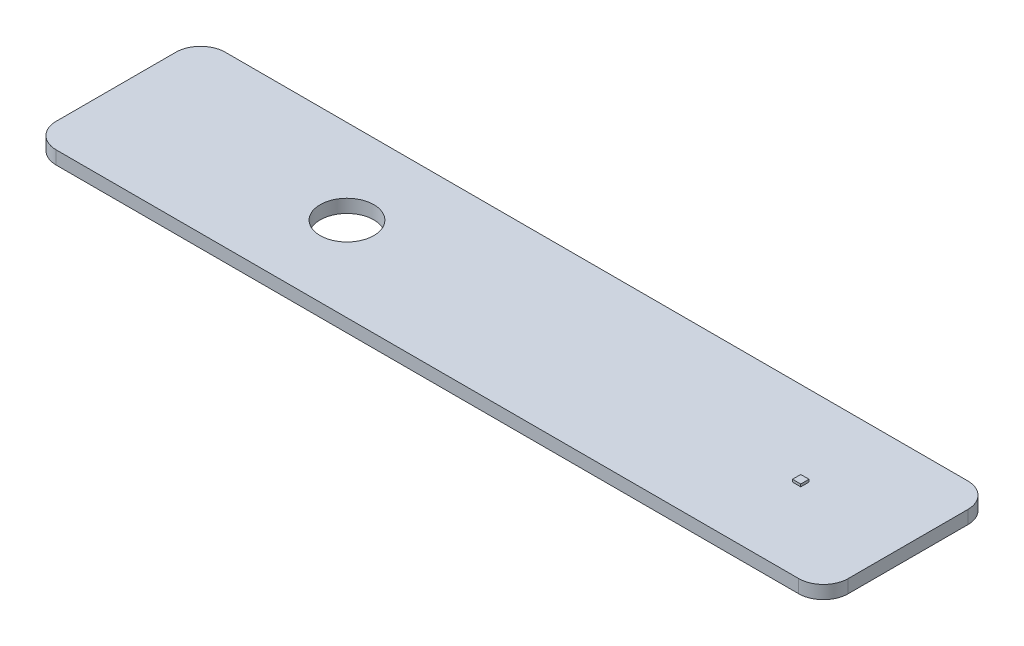
ISO-10303-21;
HEADER;
FILE_DESCRIPTION(('STEP AP214'),'2;1');
FILE_NAME('part.step','',(''),(''),'','','');
FILE_SCHEMA(('AUTOMOTIVE_DESIGN { 1 0 10303 214 1 1 1 1 }'));
ENDSEC;
DATA;
#1=APPLICATION_CONTEXT('core data for automotive mechanical design processes');
#2=APPLICATION_PROTOCOL_DEFINITION('international standard','automotive_design',2000,#1);
#3=PRODUCT_CONTEXT('',#1,'mechanical');
#4=PRODUCT('Part','Part','',(#3));
#5=PRODUCT_RELATED_PRODUCT_CATEGORY('part','',(#4));
#6=PRODUCT_DEFINITION_FORMATION('','',#4);
#7=PRODUCT_DEFINITION_CONTEXT('part definition',#1,'design');
#8=PRODUCT_DEFINITION('design','',#6,#7);
#9=PRODUCT_DEFINITION_SHAPE('','',#8);
#10=(LENGTH_UNIT() NAMED_UNIT(*) SI_UNIT(.MILLI.,.METRE.));
#11=(NAMED_UNIT(*) PLANE_ANGLE_UNIT() SI_UNIT($,.RADIAN.));
#12=(NAMED_UNIT(*) SI_UNIT($,.STERADIAN.) SOLID_ANGLE_UNIT());
#13=UNCERTAINTY_MEASURE_WITH_UNIT(LENGTH_MEASURE(1.E-05),#10,'distance_accuracy_value','');
#14=(GEOMETRIC_REPRESENTATION_CONTEXT(3) GLOBAL_UNCERTAINTY_ASSIGNED_CONTEXT((#13)) GLOBAL_UNIT_ASSIGNED_CONTEXT((#10,
#11,#12)) REPRESENTATION_CONTEXT('',''));
#15=CARTESIAN_POINT('',(0.,0.,0.));
#16=DIRECTION('',(0.,0.,1.));
#17=DIRECTION('',(1.,0.,0.));
#18=AXIS2_PLACEMENT_3D('',#15,#16,#17);
#19=CARTESIAN_POINT('',(-45.,1.6,7.25));
#20=DIRECTION('',(0.,1.,0.));
#21=DIRECTION('',(0.,0.,1.));
#22=AXIS2_PLACEMENT_3D('',#19,#20,#21);
#23=PLANE('',#22);
#24=CARTESIAN_POINT('',(-20.,1.6,0.));
#25=DIRECTION('',(0.,1.,0.));
#26=DIRECTION('',(0.,0.,1.));
#27=AXIS2_PLACEMENT_3D('',#24,#25,#26);
#28=CIRCLE('',#27,3.25);
#29=CARTESIAN_POINT('',(-20.,1.6,3.25));
#30=VERTEX_POINT('',#29);
#31=EDGE_CURVE('E416',#30,#30,#28,.T.);
#32=ORIENTED_EDGE('',*,*,#31,.F.);
#33=EDGE_LOOP('',(#32));
#34=FACE_BOUND('',#33,.T.);
#35=CARTESIAN_POINT('',(-45.,1.6,7.25));
#36=DIRECTION('',(0.,1.,0.));
#37=DIRECTION('',(0.,0.,1.));
#38=AXIS2_PLACEMENT_3D('',#35,#36,#37);
#39=CIRCLE('',#38,3.);
#40=CARTESIAN_POINT('',(-48.,1.6,7.25));
#41=VERTEX_POINT('',#40);
#42=CARTESIAN_POINT('',(-45.,1.6,10.25));
#43=VERTEX_POINT('',#42);
#44=EDGE_CURVE('E156',#41,#43,#39,.T.);
#45=ORIENTED_EDGE('',*,*,#44,.T.);
#46=DIRECTION('',(1.,0.,0.));
#47=VECTOR('',#46,1.);
#48=CARTESIAN_POINT('',(-45.,1.6,10.25));
#49=LINE('',#48,#47);
#50=CARTESIAN_POINT('',(45.,1.6,10.25));
#51=VERTEX_POINT('',#50);
#52=EDGE_CURVE('E159',#43,#51,#49,.T.);
#53=ORIENTED_EDGE('',*,*,#52,.T.);
#54=CARTESIAN_POINT('',(45.,1.6,7.25));
#55=DIRECTION('',(0.,1.,0.));
#56=DIRECTION('',(0.,0.,1.));
#57=AXIS2_PLACEMENT_3D('',#54,#55,#56);
#58=CIRCLE('',#57,3.);
#59=CARTESIAN_POINT('',(48.,1.6,7.25));
#60=VERTEX_POINT('',#59);
#61=EDGE_CURVE('E162',#51,#60,#58,.T.);
#62=ORIENTED_EDGE('',*,*,#61,.T.);
#63=DIRECTION('',(0.,0.,1.));
#64=VECTOR('',#63,1.);
#65=CARTESIAN_POINT('',(48.,1.6,-7.25));
#66=LINE('',#65,#64);
#67=CARTESIAN_POINT('',(48.,1.6,-7.25));
#68=VERTEX_POINT('',#67);
#69=EDGE_CURVE('E164',#68,#60,#66,.T.);
#70=ORIENTED_EDGE('',*,*,#69,.F.);
#71=CARTESIAN_POINT('',(45.,1.6,-7.25));
#72=DIRECTION('',(0.,-1.,0.));
#73=DIRECTION('',(0.,0.,-1.));
#74=AXIS2_PLACEMENT_3D('',#71,#72,#73);
#75=CIRCLE('',#74,3.);
#76=CARTESIAN_POINT('',(45.,1.6,-10.25));
#77=VERTEX_POINT('',#76);
#78=EDGE_CURVE('E167',#77,#68,#75,.T.);
#79=ORIENTED_EDGE('',*,*,#78,.F.);
#80=DIRECTION('',(1.,0.,0.));
#81=VECTOR('',#80,1.);
#82=CARTESIAN_POINT('',(-45.,1.6,-10.25));
#83=LINE('',#82,#81);
#84=CARTESIAN_POINT('',(-45.,1.6,-10.25));
#85=VERTEX_POINT('',#84);
#86=EDGE_CURVE('E170',#85,#77,#83,.T.);
#87=ORIENTED_EDGE('',*,*,#86,.F.);
#88=CARTESIAN_POINT('',(-45.,1.6,-7.25));
#89=DIRECTION('',(0.,1.,0.));
#90=DIRECTION('',(0.,0.,1.));
#91=AXIS2_PLACEMENT_3D('',#88,#89,#90);
#92=CIRCLE('',#91,3.);
#93=CARTESIAN_POINT('',(-48.,1.6,-7.25));
#94=VERTEX_POINT('',#93);
#95=EDGE_CURVE('E173',#85,#94,#92,.T.);
#96=ORIENTED_EDGE('',*,*,#95,.T.);
#97=DIRECTION('',(0.,0.,1.));
#98=VECTOR('',#97,1.);
#99=CARTESIAN_POINT('',(-48.,1.6,-7.25));
#100=LINE('',#99,#98);
#101=EDGE_CURVE('E175',#94,#41,#100,.T.);
#102=ORIENTED_EDGE('',*,*,#101,.T.);
#103=EDGE_LOOP('',(#45,#53,#62,#70,#79,#87,#96,#102));
#104=FACE_BOUND('',#103,.T.);
#105=DIRECTION('',(1.,0.,0.));
#106=VECTOR('',#105,1.);
#107=CARTESIAN_POINT('',(34.5,1.6,0.5));
#108=LINE('',#107,#106);
#109=CARTESIAN_POINT('',(34.5,1.6,0.5));
#110=VERTEX_POINT('',#109);
#111=CARTESIAN_POINT('',(35.5,1.6,0.5));
#112=VERTEX_POINT('',#111);
#113=EDGE_CURVE('E51',#110,#112,#108,.T.);
#114=ORIENTED_EDGE('',*,*,#113,.F.);
#115=DIRECTION('',(0.,0.,1.));
#116=VECTOR('',#115,1.);
#117=CARTESIAN_POINT('',(34.5,1.6,-0.5));
#118=LINE('',#117,#116);
#119=CARTESIAN_POINT('',(34.5,1.6,-0.5));
#120=VERTEX_POINT('',#119);
#121=EDGE_CURVE('E146',#120,#110,#118,.T.);
#122=ORIENTED_EDGE('',*,*,#121,.F.);
#123=DIRECTION('',(1.,0.,0.));
#124=VECTOR('',#123,1.);
#125=CARTESIAN_POINT('',(34.5,1.6,-0.5));
#126=LINE('',#125,#124);
#127=CARTESIAN_POINT('',(35.5,1.6,-0.5));
#128=VERTEX_POINT('',#127);
#129=EDGE_CURVE('E143',#120,#128,#126,.T.);
#130=ORIENTED_EDGE('',*,*,#129,.T.);
#131=DIRECTION('',(0.,0.,1.));
#132=VECTOR('',#131,1.);
#133=CARTESIAN_POINT('',(35.5,1.6,-0.5));
#134=LINE('',#133,#132);
#135=EDGE_CURVE('E56',#128,#112,#134,.T.);
#136=ORIENTED_EDGE('',*,*,#135,.T.);
#137=EDGE_LOOP('',(#114,#122,#130,#136));
#138=FACE_BOUND('',#137,.T.);
#139=ADVANCED_FACE('F36',(#34,#104,#138),#23,.T.);
#140=CARTESIAN_POINT('',(-45.,1.6,7.25));
#141=DIRECTION('',(0.,-1.,0.));
#142=DIRECTION('',(0.,0.,-1.));
#143=AXIS2_PLACEMENT_3D('',#140,#141,#142);
#144=CYLINDRICAL_SURFACE('',#143,3.);
#145=CARTESIAN_POINT('',(-45.,0.,7.25));
#146=DIRECTION('',(0.,1.,0.));
#147=DIRECTION('',(0.,0.,1.));
#148=AXIS2_PLACEMENT_3D('',#145,#146,#147);
#149=CIRCLE('',#148,3.);
#150=CARTESIAN_POINT('',(-48.,0.,7.25));
#151=VERTEX_POINT('',#150);
#152=CARTESIAN_POINT('',(-45.,0.,10.25));
#153=VERTEX_POINT('',#152);
#154=EDGE_CURVE('E147',#151,#153,#149,.T.);
#155=ORIENTED_EDGE('',*,*,#154,.T.);
#156=DIRECTION('',(0.,-1.,0.));
#157=VECTOR('',#156,1.);
#158=CARTESIAN_POINT('',(-45.,1.6,10.25));
#159=LINE('',#158,#157);
#160=EDGE_CURVE('E11',#43,#153,#159,.T.);
#161=ORIENTED_EDGE('',*,*,#160,.F.);
#162=ORIENTED_EDGE('',*,*,#44,.F.);
#163=DIRECTION('',(0.,-1.,0.));
#164=VECTOR('',#163,1.);
#165=CARTESIAN_POINT('',(-48.,1.6,7.25));
#166=LINE('',#165,#164);
#167=EDGE_CURVE('E176',#41,#151,#166,.T.);
#168=ORIENTED_EDGE('',*,*,#167,.T.);
#169=EDGE_LOOP('',(#155,#161,#162,#168));
#170=FACE_BOUND('',#169,.T.);
#171=ADVANCED_FACE('F38',(#170),#144,.T.);
#172=CARTESIAN_POINT('',(-45.,1.6,10.25));
#173=DIRECTION('',(0.,0.,-1.));
#174=DIRECTION('',(-1.,0.,0.));
#175=AXIS2_PLACEMENT_3D('',#172,#173,#174);
#176=PLANE('',#175);
#177=DIRECTION('',(1.,0.,0.));
#178=VECTOR('',#177,1.);
#179=CARTESIAN_POINT('',(-45.,0.,10.25));
#180=LINE('',#179,#178);
#181=CARTESIAN_POINT('',(45.,0.,10.25));
#182=VERTEX_POINT('',#181);
#183=EDGE_CURVE('E150',#153,#182,#180,.T.);
#184=ORIENTED_EDGE('',*,*,#183,.T.);
#185=DIRECTION('',(0.,-1.,0.));
#186=VECTOR('',#185,1.);
#187=CARTESIAN_POINT('',(45.,1.6,10.25));
#188=LINE('',#187,#186);
#189=EDGE_CURVE('E44',#51,#182,#188,.T.);
#190=ORIENTED_EDGE('',*,*,#189,.F.);
#191=ORIENTED_EDGE('',*,*,#52,.F.);
#192=ORIENTED_EDGE('',*,*,#160,.T.);
#193=EDGE_LOOP('',(#184,#190,#191,#192));
#194=FACE_BOUND('',#193,.T.);
#195=ADVANCED_FACE('F243',(#194),#176,.F.);
#196=CARTESIAN_POINT('',(45.,1.6,7.25));
#197=DIRECTION('',(0.,-1.,0.));
#198=DIRECTION('',(0.,0.,-1.));
#199=AXIS2_PLACEMENT_3D('',#196,#197,#198);
#200=CYLINDRICAL_SURFACE('',#199,3.);
#201=CARTESIAN_POINT('',(45.,0.,7.25));
#202=DIRECTION('',(0.,1.,0.));
#203=DIRECTION('',(0.,0.,1.));
#204=AXIS2_PLACEMENT_3D('',#201,#202,#203);
#205=CIRCLE('',#204,3.);
#206=CARTESIAN_POINT('',(48.,0.,7.25));
#207=VERTEX_POINT('',#206);
#208=EDGE_CURVE('E179',#182,#207,#205,.T.);
#209=ORIENTED_EDGE('',*,*,#208,.T.);
#210=DIRECTION('',(0.,-1.,0.));
#211=VECTOR('',#210,1.);
#212=CARTESIAN_POINT('',(48.,1.6,7.25));
#213=LINE('',#212,#211);
#214=EDGE_CURVE('E205',#60,#207,#213,.T.);
#215=ORIENTED_EDGE('',*,*,#214,.F.);
#216=ORIENTED_EDGE('',*,*,#61,.F.);
#217=ORIENTED_EDGE('',*,*,#189,.T.);
#218=EDGE_LOOP('',(#209,#215,#216,#217));
#219=FACE_BOUND('',#218,.T.);
#220=ADVANCED_FACE('F211',(#219),#200,.T.);
#221=CARTESIAN_POINT('',(48.,1.6,-7.25));
#222=DIRECTION('',(1.,0.,0.));
#223=DIRECTION('',(0.,0.,-1.));
#224=AXIS2_PLACEMENT_3D('',#221,#222,#223);
#225=PLANE('',#224);
#226=DIRECTION('',(0.,0.,1.));
#227=VECTOR('',#226,1.);
#228=CARTESIAN_POINT('',(48.,0.,-7.25));
#229=LINE('',#228,#227);
#230=CARTESIAN_POINT('',(48.,0.,-7.25));
#231=VERTEX_POINT('',#230);
#232=EDGE_CURVE('E182',#231,#207,#229,.T.);
#233=ORIENTED_EDGE('',*,*,#232,.F.);
#234=DIRECTION('',(0.,-1.,0.));
#235=VECTOR('',#234,1.);
#236=CARTESIAN_POINT('',(48.,1.6,-7.25));
#237=LINE('',#236,#235);
#238=EDGE_CURVE('E203',#68,#231,#237,.T.);
#239=ORIENTED_EDGE('',*,*,#238,.F.);
#240=ORIENTED_EDGE('',*,*,#69,.T.);
#241=ORIENTED_EDGE('',*,*,#214,.T.);
#242=EDGE_LOOP('',(#233,#239,#240,#241));
#243=FACE_BOUND('',#242,.T.);
#244=ADVANCED_FACE('F220',(#243),#225,.T.);
#245=CARTESIAN_POINT('',(45.,1.6,-7.25));
#246=DIRECTION('',(0.,-1.,0.));
#247=DIRECTION('',(0.,0.,-1.));
#248=AXIS2_PLACEMENT_3D('',#245,#246,#247);
#249=CYLINDRICAL_SURFACE('',#248,3.);
#250=CARTESIAN_POINT('',(45.,0.,-7.25));
#251=DIRECTION('',(0.,-1.,0.));
#252=DIRECTION('',(0.,0.,-1.));
#253=AXIS2_PLACEMENT_3D('',#250,#251,#252);
#254=CIRCLE('',#253,3.);
#255=CARTESIAN_POINT('',(45.,0.,-10.25));
#256=VERTEX_POINT('',#255);
#257=EDGE_CURVE('E185',#256,#231,#254,.T.);
#258=ORIENTED_EDGE('',*,*,#257,.F.);
#259=DIRECTION('',(0.,-1.,0.));
#260=VECTOR('',#259,1.);
#261=CARTESIAN_POINT('',(45.,1.6,-10.25));
#262=LINE('',#261,#260);
#263=EDGE_CURVE('E201',#77,#256,#262,.T.);
#264=ORIENTED_EDGE('',*,*,#263,.F.);
#265=ORIENTED_EDGE('',*,*,#78,.T.);
#266=ORIENTED_EDGE('',*,*,#238,.T.);
#267=EDGE_LOOP('',(#258,#264,#265,#266));
#268=FACE_BOUND('',#267,.T.);
#269=ADVANCED_FACE('F226',(#268),#249,.T.);
#270=CARTESIAN_POINT('',(-45.,1.6,-10.25));
#271=DIRECTION('',(0.,0.,-1.));
#272=DIRECTION('',(-1.,0.,0.));
#273=AXIS2_PLACEMENT_3D('',#270,#271,#272);
#274=PLANE('',#273);
#275=DIRECTION('',(1.,0.,0.));
#276=VECTOR('',#275,1.);
#277=CARTESIAN_POINT('',(-45.,0.,-10.25));
#278=LINE('',#277,#276);
#279=CARTESIAN_POINT('',(-45.,0.,-10.25));
#280=VERTEX_POINT('',#279);
#281=EDGE_CURVE('E188',#280,#256,#278,.T.);
#282=ORIENTED_EDGE('',*,*,#281,.F.);
#283=DIRECTION('',(0.,-1.,0.));
#284=VECTOR('',#283,1.);
#285=CARTESIAN_POINT('',(-45.,1.6,-10.25));
#286=LINE('',#285,#284);
#287=EDGE_CURVE('E199',#85,#280,#286,.T.);
#288=ORIENTED_EDGE('',*,*,#287,.F.);
#289=ORIENTED_EDGE('',*,*,#86,.T.);
#290=ORIENTED_EDGE('',*,*,#263,.T.);
#291=EDGE_LOOP('',(#282,#288,#289,#290));
#292=FACE_BOUND('',#291,.T.);
#293=ADVANCED_FACE('F229',(#292),#274,.T.);
#294=CARTESIAN_POINT('',(-45.,1.6,-7.25));
#295=DIRECTION('',(0.,-1.,0.));
#296=DIRECTION('',(0.,0.,-1.));
#297=AXIS2_PLACEMENT_3D('',#294,#295,#296);
#298=CYLINDRICAL_SURFACE('',#297,3.);
#299=CARTESIAN_POINT('',(-45.,0.,-7.25));
#300=DIRECTION('',(0.,1.,0.));
#301=DIRECTION('',(0.,0.,1.));
#302=AXIS2_PLACEMENT_3D('',#299,#300,#301);
#303=CIRCLE('',#302,3.);
#304=CARTESIAN_POINT('',(-48.,0.,-7.25));
#305=VERTEX_POINT('',#304);
#306=EDGE_CURVE('E191',#280,#305,#303,.T.);
#307=ORIENTED_EDGE('',*,*,#306,.T.);
#308=DIRECTION('',(0.,-1.,0.));
#309=VECTOR('',#308,1.);
#310=CARTESIAN_POINT('',(-48.,1.6,-7.25));
#311=LINE('',#310,#309);
#312=EDGE_CURVE('E196',#94,#305,#311,.T.);
#313=ORIENTED_EDGE('',*,*,#312,.F.);
#314=ORIENTED_EDGE('',*,*,#95,.F.);
#315=ORIENTED_EDGE('',*,*,#287,.T.);
#316=EDGE_LOOP('',(#307,#313,#314,#315));
#317=FACE_BOUND('',#316,.T.);
#318=ADVANCED_FACE('F235',(#317),#298,.T.);
#319=CARTESIAN_POINT('',(-48.,1.6,-7.25));
#320=DIRECTION('',(1.,0.,0.));
#321=DIRECTION('',(0.,0.,-1.));
#322=AXIS2_PLACEMENT_3D('',#319,#320,#321);
#323=PLANE('',#322);
#324=DIRECTION('',(0.,0.,1.));
#325=VECTOR('',#324,1.);
#326=CARTESIAN_POINT('',(-48.,0.,-7.25));
#327=LINE('',#326,#325);
#328=EDGE_CURVE('E160',#305,#151,#327,.T.);
#329=ORIENTED_EDGE('',*,*,#328,.T.);
#330=ORIENTED_EDGE('',*,*,#167,.F.);
#331=ORIENTED_EDGE('',*,*,#101,.F.);
#332=ORIENTED_EDGE('',*,*,#312,.T.);
#333=EDGE_LOOP('',(#329,#330,#331,#332));
#334=FACE_BOUND('',#333,.T.);
#335=ADVANCED_FACE('F239',(#334),#323,.F.);
#336=CARTESIAN_POINT('',(-45.,0.,7.25));
#337=DIRECTION('',(0.,1.,0.));
#338=DIRECTION('',(0.,0.,1.));
#339=AXIS2_PLACEMENT_3D('',#336,#337,#338);
#340=PLANE('',#339);
#341=CARTESIAN_POINT('',(-20.,0.,0.));
#342=DIRECTION('',(0.,1.,0.));
#343=DIRECTION('',(0.,0.,1.));
#344=AXIS2_PLACEMENT_3D('',#341,#342,#343);
#345=CIRCLE('',#344,3.25);
#346=CARTESIAN_POINT('',(-20.,0.,3.25));
#347=VERTEX_POINT('',#346);
#348=EDGE_CURVE('E414',#347,#347,#345,.T.);
#349=ORIENTED_EDGE('',*,*,#348,.T.);
#350=EDGE_LOOP('',(#349));
#351=FACE_BOUND('',#350,.T.);
#352=ORIENTED_EDGE('',*,*,#154,.F.);
#353=ORIENTED_EDGE('',*,*,#328,.F.);
#354=ORIENTED_EDGE('',*,*,#306,.F.);
#355=ORIENTED_EDGE('',*,*,#281,.T.);
#356=ORIENTED_EDGE('',*,*,#257,.T.);
#357=ORIENTED_EDGE('',*,*,#232,.T.);
#358=ORIENTED_EDGE('',*,*,#208,.F.);
#359=ORIENTED_EDGE('',*,*,#183,.F.);
#360=EDGE_LOOP('',(#352,#353,#354,#355,#356,#357,#358,#359));
#361=FACE_BOUND('',#360,.T.);
#362=ADVANCED_FACE('F216',(#351,#361),#340,.F.);
#363=CARTESIAN_POINT('',(34.5,1.9,-0.5));
#364=DIRECTION('',(1.,0.,0.));
#365=DIRECTION('',(0.,0.,-1.));
#366=AXIS2_PLACEMENT_3D('',#363,#364,#365);
#367=PLANE('',#366);
#368=ORIENTED_EDGE('',*,*,#121,.T.);
#369=DIRECTION('',(0.,-1.,0.));
#370=VECTOR('',#369,1.);
#371=CARTESIAN_POINT('',(34.5,1.9,0.5));
#372=LINE('',#371,#370);
#373=CARTESIAN_POINT('',(34.5,1.9,0.5));
#374=VERTEX_POINT('',#373);
#375=EDGE_CURVE('E127',#374,#110,#372,.T.);
#376=ORIENTED_EDGE('',*,*,#375,.F.);
#377=DIRECTION('',(0.,0.,1.));
#378=VECTOR('',#377,1.);
#379=CARTESIAN_POINT('',(34.5,1.9,-0.5));
#380=LINE('',#379,#378);
#381=CARTESIAN_POINT('',(34.5,1.9,-0.5));
#382=VERTEX_POINT('',#381);
#383=EDGE_CURVE('E134',#382,#374,#380,.T.);
#384=ORIENTED_EDGE('',*,*,#383,.F.);
#385=DIRECTION('',(0.,-1.,0.));
#386=VECTOR('',#385,1.);
#387=CARTESIAN_POINT('',(34.5,1.9,-0.5));
#388=LINE('',#387,#386);
#389=EDGE_CURVE('E422',#382,#120,#388,.T.);
#390=ORIENTED_EDGE('',*,*,#389,.T.);
#391=EDGE_LOOP('',(#368,#376,#384,#390));
#392=FACE_BOUND('',#391,.T.);
#393=ADVANCED_FACE('F145',(#392),#367,.F.);
#394=CARTESIAN_POINT('',(34.5,1.9,0.5));
#395=DIRECTION('',(0.,0.,-1.));
#396=DIRECTION('',(-1.,0.,0.));
#397=AXIS2_PLACEMENT_3D('',#394,#395,#396);
#398=PLANE('',#397);
#399=ORIENTED_EDGE('',*,*,#113,.T.);
#400=DIRECTION('',(0.,-1.,0.));
#401=VECTOR('',#400,1.);
#402=CARTESIAN_POINT('',(35.5,1.9,0.5));
#403=LINE('',#402,#401);
#404=CARTESIAN_POINT('',(35.5,1.9,0.5));
#405=VERTEX_POINT('',#404);
#406=EDGE_CURVE('E129',#405,#112,#403,.T.);
#407=ORIENTED_EDGE('',*,*,#406,.F.);
#408=DIRECTION('',(1.,0.,0.));
#409=VECTOR('',#408,1.);
#410=CARTESIAN_POINT('',(34.5,1.9,0.5));
#411=LINE('',#410,#409);
#412=EDGE_CURVE('E123',#374,#405,#411,.T.);
#413=ORIENTED_EDGE('',*,*,#412,.F.);
#414=ORIENTED_EDGE('',*,*,#375,.T.);
#415=EDGE_LOOP('',(#399,#407,#413,#414));
#416=FACE_BOUND('',#415,.T.);
#417=ADVANCED_FACE('F125',(#416),#398,.F.);
#418=CARTESIAN_POINT('',(35.5,1.9,-0.5));
#419=DIRECTION('',(1.,0.,0.));
#420=DIRECTION('',(0.,0.,-1.));
#421=AXIS2_PLACEMENT_3D('',#418,#419,#420);
#422=PLANE('',#421);
#423=ORIENTED_EDGE('',*,*,#135,.F.);
#424=DIRECTION('',(0.,-1.,0.));
#425=VECTOR('',#424,1.);
#426=CARTESIAN_POINT('',(35.5,1.9,-0.5));
#427=LINE('',#426,#425);
#428=CARTESIAN_POINT('',(35.5,1.9,-0.5));
#429=VERTEX_POINT('',#428);
#430=EDGE_CURVE('E152',#429,#128,#427,.T.);
#431=ORIENTED_EDGE('',*,*,#430,.F.);
#432=DIRECTION('',(0.,0.,1.));
#433=VECTOR('',#432,1.);
#434=CARTESIAN_POINT('',(35.5,1.9,-0.5));
#435=LINE('',#434,#433);
#436=EDGE_CURVE('E133',#429,#405,#435,.T.);
#437=ORIENTED_EDGE('',*,*,#436,.T.);
#438=ORIENTED_EDGE('',*,*,#406,.T.);
#439=EDGE_LOOP('',(#423,#431,#437,#438));
#440=FACE_BOUND('',#439,.T.);
#441=ADVANCED_FACE('F307',(#440),#422,.T.);
#442=CARTESIAN_POINT('',(34.5,1.9,-0.5));
#443=DIRECTION('',(0.,0.,-1.));
#444=DIRECTION('',(-1.,0.,0.));
#445=AXIS2_PLACEMENT_3D('',#442,#443,#444);
#446=PLANE('',#445);
#447=ORIENTED_EDGE('',*,*,#129,.F.);
#448=ORIENTED_EDGE('',*,*,#389,.F.);
#449=DIRECTION('',(1.,0.,0.));
#450=VECTOR('',#449,1.);
#451=CARTESIAN_POINT('',(34.5,1.9,-0.5));
#452=LINE('',#451,#450);
#453=EDGE_CURVE('E140',#382,#429,#452,.T.);
#454=ORIENTED_EDGE('',*,*,#453,.T.);
#455=ORIENTED_EDGE('',*,*,#430,.T.);
#456=EDGE_LOOP('',(#447,#448,#454,#455));
#457=FACE_BOUND('',#456,.T.);
#458=ADVANCED_FACE('F313',(#457),#446,.T.);
#459=CARTESIAN_POINT('',(0.,1.9,0.));
#460=DIRECTION('',(0.,1.,0.));
#461=DIRECTION('',(0.,0.,1.));
#462=AXIS2_PLACEMENT_3D('',#459,#460,#461);
#463=PLANE('',#462);
#464=ORIENTED_EDGE('',*,*,#383,.T.);
#465=ORIENTED_EDGE('',*,*,#412,.T.);
#466=ORIENTED_EDGE('',*,*,#436,.F.);
#467=ORIENTED_EDGE('',*,*,#453,.F.);
#468=EDGE_LOOP('',(#464,#465,#466,#467));
#469=FACE_BOUND('',#468,.T.);
#470=ADVANCED_FACE('F138',(#469),#463,.T.);
#471=CARTESIAN_POINT('',(-20.,0.,0.));
#472=DIRECTION('',(0.,1.,0.));
#473=DIRECTION('',(0.,0.,1.));
#474=AXIS2_PLACEMENT_3D('',#471,#472,#473);
#475=CYLINDRICAL_SURFACE('',#474,3.25);
#476=ORIENTED_EDGE('',*,*,#348,.F.);
#477=EDGE_LOOP('',(#476));
#478=FACE_BOUND('',#477,.T.);
#479=ORIENTED_EDGE('',*,*,#31,.T.);
#480=EDGE_LOOP('',(#479));
#481=FACE_BOUND('',#480,.T.);
#482=ADVANCED_FACE('F328',(#478,#481),#475,.F.);
#483=CLOSED_SHELL('',(#139,#171,#195,#220,#244,#269,#293,#318,#335,#362,#393,#417,#441,#458,
#470,#482));
#484=MANIFOLD_SOLID_BREP('B2',#483);
#485=ADVANCED_BREP_SHAPE_REPRESENTATION('',(#18,#484),#14);
#486=SHAPE_DEFINITION_REPRESENTATION(#9,#485);
ENDSEC;
END-ISO-10303-21;
